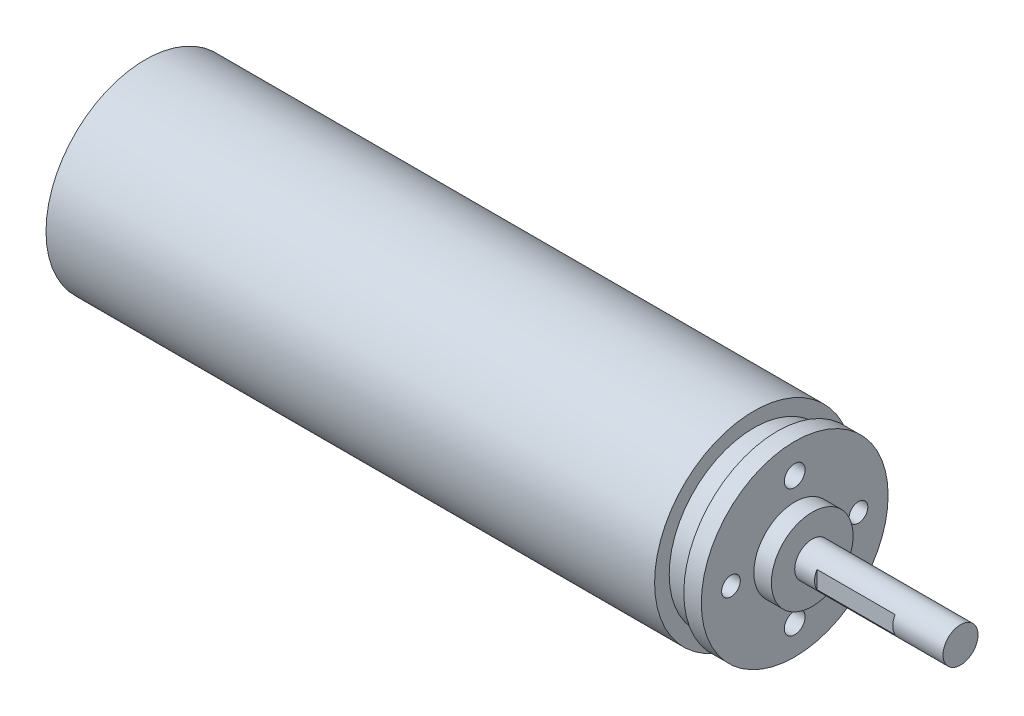
ISO-10303-21;
HEADER;
FILE_DESCRIPTION(('STEP AP214'),'2;1');
FILE_NAME('part.step','',(''),(''),'','','');
FILE_SCHEMA(('AUTOMOTIVE_DESIGN { 1 0 10303 214 1 1 1 1 }'));
ENDSEC;
DATA;
#1=APPLICATION_CONTEXT('core data for automotive mechanical design processes');
#2=APPLICATION_PROTOCOL_DEFINITION('international standard','automotive_design',2000,#1);
#3=PRODUCT_CONTEXT('',#1,'mechanical');
#4=PRODUCT('Part','Part','',(#3));
#5=PRODUCT_RELATED_PRODUCT_CATEGORY('part','',(#4));
#6=PRODUCT_DEFINITION_FORMATION('','',#4);
#7=PRODUCT_DEFINITION_CONTEXT('part definition',#1,'design');
#8=PRODUCT_DEFINITION('design','',#6,#7);
#9=PRODUCT_DEFINITION_SHAPE('','',#8);
#10=(LENGTH_UNIT() NAMED_UNIT(*) SI_UNIT(.MILLI.,.METRE.));
#11=(NAMED_UNIT(*) PLANE_ANGLE_UNIT() SI_UNIT($,.RADIAN.));
#12=(NAMED_UNIT(*) SI_UNIT($,.STERADIAN.) SOLID_ANGLE_UNIT());
#13=UNCERTAINTY_MEASURE_WITH_UNIT(LENGTH_MEASURE(1.E-05),#10,'distance_accuracy_value','');
#14=(GEOMETRIC_REPRESENTATION_CONTEXT(3) GLOBAL_UNCERTAINTY_ASSIGNED_CONTEXT((#13)) GLOBAL_UNIT_ASSIGNED_CONTEXT((#10,
#11,#12)) REPRESENTATION_CONTEXT('',''));
#15=CARTESIAN_POINT('',(0.,0.,0.));
#16=DIRECTION('',(0.,0.,1.));
#17=DIRECTION('',(1.,0.,0.));
#18=AXIS2_PLACEMENT_3D('',#15,#16,#17);
#19=CARTESIAN_POINT('',(0.,0.,0.));
#20=DIRECTION('',(-1.,0.,0.));
#21=DIRECTION('',(0.,0.,1.));
#22=AXIS2_PLACEMENT_3D('',#19,#20,#21);
#23=CYLINDRICAL_SURFACE('',#22,1.5);
#24=CARTESIAN_POINT('',(33.5,0.,0.));
#25=DIRECTION('',(-1.,0.,0.));
#26=DIRECTION('',(0.,0.,1.));
#27=AXIS2_PLACEMENT_3D('',#24,#25,#26);
#28=CIRCLE('',#27,1.5);
#29=CARTESIAN_POINT('',(33.5,0.,1.5));
#30=VERTEX_POINT('',#29);
#31=EDGE_CURVE('E134',#30,#30,#28,.T.);
#32=ORIENTED_EDGE('',*,*,#31,.F.);
#33=EDGE_LOOP('',(#32));
#34=FACE_BOUND('',#33,.T.);
#35=CARTESIAN_POINT('',(46.2,0.,0.));
#36=DIRECTION('',(-1.,0.,0.));
#37=DIRECTION('',(0.,0.,1.));
#38=AXIS2_PLACEMENT_3D('',#35,#36,#37);
#39=CIRCLE('',#38,1.5);
#40=CARTESIAN_POINT('',(46.2,0.,1.5));
#41=VERTEX_POINT('',#40);
#42=EDGE_CURVE('E137',#41,#41,#39,.T.);
#43=ORIENTED_EDGE('',*,*,#42,.T.);
#44=EDGE_LOOP('',(#43));
#45=FACE_BOUND('',#44,.T.);
#46=CARTESIAN_POINT('',(41.9,0.,0.));
#47=DIRECTION('',(-1.,0.,0.));
#48=DIRECTION('',(0.,0.,1.));
#49=AXIS2_PLACEMENT_3D('',#46,#47,#48);
#50=CIRCLE('',#49,1.5);
#51=CARTESIAN_POINT('',(41.9,0.748331477354788,1.3));
#52=VERTEX_POINT('',#51);
#53=CARTESIAN_POINT('',(41.9,-0.748331477354789,1.3));
#54=VERTEX_POINT('',#53);
#55=EDGE_CURVE('E11',#52,#54,#50,.F.);
#56=ORIENTED_EDGE('',*,*,#55,.T.);
#57=DIRECTION('',(-1.,0.,0.));
#58=VECTOR('',#57,1.);
#59=CARTESIAN_POINT('',(0.,-0.748331477354788,1.3));
#60=LINE('',#59,#58);
#61=CARTESIAN_POINT('',(35.2,-0.748331477354788,1.3));
#62=VERTEX_POINT('',#61);
#63=EDGE_CURVE('E143',#54,#62,#60,.T.);
#64=ORIENTED_EDGE('',*,*,#63,.T.);
#65=CARTESIAN_POINT('',(35.2,0.,0.));
#66=DIRECTION('',(1.,0.,0.));
#67=DIRECTION('',(0.,0.,-1.));
#68=AXIS2_PLACEMENT_3D('',#65,#66,#67);
#69=CIRCLE('',#68,1.5);
#70=CARTESIAN_POINT('',(35.2,0.748331477354788,1.3));
#71=VERTEX_POINT('',#70);
#72=EDGE_CURVE('E140',#62,#71,#69,.F.);
#73=ORIENTED_EDGE('',*,*,#72,.T.);
#74=DIRECTION('',(-1.,0.,0.));
#75=VECTOR('',#74,1.);
#76=CARTESIAN_POINT('',(0.,0.748331477354788,1.3));
#77=LINE('',#76,#75);
#78=EDGE_CURVE('E44',#71,#52,#77,.F.);
#79=ORIENTED_EDGE('',*,*,#78,.T.);
#80=EDGE_LOOP('',(#56,#64,#73,#79));
#81=FACE_BOUND('',#80,.T.);
#82=ADVANCED_FACE('F36',(#34,#45,#81),#23,.T.);
#83=CARTESIAN_POINT('',(46.2,-1.5,0.));
#84=DIRECTION('',(1.,0.,0.));
#85=DIRECTION('',(0.,0.,-1.));
#86=AXIS2_PLACEMENT_3D('',#83,#84,#85);
#87=PLANE('',#86);
#88=ORIENTED_EDGE('',*,*,#42,.F.);
#89=EDGE_LOOP('',(#88));
#90=FACE_BOUND('',#89,.T.);
#91=ADVANCED_FACE('F38',(#90),#87,.T.);
#92=CARTESIAN_POINT('',(33.5,-3.5,0.));
#93=DIRECTION('',(1.,0.,0.));
#94=DIRECTION('',(0.,0.,-1.));
#95=AXIS2_PLACEMENT_3D('',#92,#93,#94);
#96=PLANE('',#95);
#97=ORIENTED_EDGE('',*,*,#31,.T.);
#98=EDGE_LOOP('',(#97));
#99=FACE_BOUND('',#98,.T.);
#100=CARTESIAN_POINT('',(33.5,0.,0.));
#101=DIRECTION('',(-1.,0.,0.));
#102=DIRECTION('',(0.,0.,1.));
#103=AXIS2_PLACEMENT_3D('',#100,#101,#102);
#104=CIRCLE('',#103,3.5);
#105=CARTESIAN_POINT('',(33.5,0.,3.5));
#106=VERTEX_POINT('',#105);
#107=EDGE_CURVE('E131',#106,#106,#104,.T.);
#108=ORIENTED_EDGE('',*,*,#107,.F.);
#109=EDGE_LOOP('',(#108));
#110=FACE_BOUND('',#109,.T.);
#111=ADVANCED_FACE('F166',(#99,#110),#96,.T.);
#112=CARTESIAN_POINT('',(0.,0.,0.));
#113=DIRECTION('',(-1.,0.,0.));
#114=DIRECTION('',(0.,0.,1.));
#115=AXIS2_PLACEMENT_3D('',#112,#113,#114);
#116=CYLINDRICAL_SURFACE('',#115,3.5);
#117=ORIENTED_EDGE('',*,*,#107,.T.);
#118=EDGE_LOOP('',(#117));
#119=FACE_BOUND('',#118,.T.);
#120=CARTESIAN_POINT('',(32.,0.,0.));
#121=DIRECTION('',(-1.,0.,0.));
#122=DIRECTION('',(0.,0.,1.));
#123=AXIS2_PLACEMENT_3D('',#120,#121,#122);
#124=CIRCLE('',#123,3.5);
#125=CARTESIAN_POINT('',(32.,0.,3.5));
#126=VERTEX_POINT('',#125);
#127=EDGE_CURVE('E128',#126,#126,#124,.T.);
#128=ORIENTED_EDGE('',*,*,#127,.F.);
#129=EDGE_LOOP('',(#128));
#130=FACE_BOUND('',#129,.T.);
#131=ADVANCED_FACE('F173',(#119,#130),#116,.T.);
#132=CARTESIAN_POINT('',(32.,-8.,0.));
#133=DIRECTION('',(1.,0.,0.));
#134=DIRECTION('',(0.,0.,-1.));
#135=AXIS2_PLACEMENT_3D('',#132,#133,#134);
#136=PLANE('',#135);
#137=CARTESIAN_POINT('',(32.,0.,5.46));
#138=DIRECTION('',(1.,0.,0.));
#139=DIRECTION('',(0.,0.,-1.));
#140=AXIS2_PLACEMENT_3D('',#137,#138,#139);
#141=CIRCLE('',#140,0.799999999999999);
#142=CARTESIAN_POINT('',(32.,0.,4.66));
#143=VERTEX_POINT('',#142);
#144=EDGE_CURVE('E85',#143,#143,#141,.T.);
#145=ORIENTED_EDGE('',*,*,#144,.F.);
#146=EDGE_LOOP('',(#145));
#147=FACE_BOUND('',#146,.T.);
#148=CARTESIAN_POINT('',(32.,0.,-5.46));
#149=DIRECTION('',(1.,0.,0.));
#150=DIRECTION('',(0.,0.,-1.));
#151=AXIS2_PLACEMENT_3D('',#148,#149,#150);
#152=CIRCLE('',#151,0.799999999999999);
#153=CARTESIAN_POINT('',(32.,0.,-6.26));
#154=VERTEX_POINT('',#153);
#155=EDGE_CURVE('E84',#154,#154,#152,.T.);
#156=ORIENTED_EDGE('',*,*,#155,.F.);
#157=EDGE_LOOP('',(#156));
#158=FACE_BOUND('',#157,.T.);
#159=CARTESIAN_POINT('',(32.,5.46,0.));
#160=DIRECTION('',(1.,0.,0.));
#161=DIRECTION('',(0.,0.,-1.));
#162=AXIS2_PLACEMENT_3D('',#159,#160,#161);
#163=CIRCLE('',#162,0.888999999999999);
#164=CARTESIAN_POINT('',(32.,5.46,-0.888999999999999));
#165=VERTEX_POINT('',#164);
#166=EDGE_CURVE('E97',#165,#165,#163,.T.);
#167=ORIENTED_EDGE('',*,*,#166,.F.);
#168=EDGE_LOOP('',(#167));
#169=FACE_BOUND('',#168,.T.);
#170=CARTESIAN_POINT('',(32.,-5.46,0.));
#171=DIRECTION('',(1.,0.,0.));
#172=DIRECTION('',(0.,0.,-1.));
#173=AXIS2_PLACEMENT_3D('',#170,#171,#172);
#174=CIRCLE('',#173,0.888999999999999);
#175=CARTESIAN_POINT('',(32.,-5.46,-0.889));
#176=VERTEX_POINT('',#175);
#177=EDGE_CURVE('E103',#176,#176,#174,.T.);
#178=ORIENTED_EDGE('',*,*,#177,.F.);
#179=EDGE_LOOP('',(#178));
#180=FACE_BOUND('',#179,.T.);
#181=ORIENTED_EDGE('',*,*,#127,.T.);
#182=EDGE_LOOP('',(#181));
#183=FACE_BOUND('',#182,.T.);
#184=CARTESIAN_POINT('',(32.,0.,0.));
#185=DIRECTION('',(-1.,0.,0.));
#186=DIRECTION('',(0.,0.,1.));
#187=AXIS2_PLACEMENT_3D('',#184,#185,#186);
#188=CIRCLE('',#187,8.);
#189=CARTESIAN_POINT('',(32.,0.,8.));
#190=VERTEX_POINT('',#189);
#191=EDGE_CURVE('E125',#190,#190,#188,.T.);
#192=ORIENTED_EDGE('',*,*,#191,.F.);
#193=EDGE_LOOP('',(#192));
#194=FACE_BOUND('',#193,.T.);
#195=ADVANCED_FACE('F177',(#147,#158,#169,#180,#183,#194),#136,.T.);
#196=CARTESIAN_POINT('',(0.,0.,0.));
#197=DIRECTION('',(-1.,0.,0.));
#198=DIRECTION('',(0.,0.,1.));
#199=AXIS2_PLACEMENT_3D('',#196,#197,#198);
#200=CYLINDRICAL_SURFACE('',#199,8.);
#201=ORIENTED_EDGE('',*,*,#191,.T.);
#202=EDGE_LOOP('',(#201));
#203=FACE_BOUND('',#202,.T.);
#204=CARTESIAN_POINT('',(30.5,0.,0.));
#205=DIRECTION('',(-1.,0.,0.));
#206=DIRECTION('',(0.,0.,1.));
#207=AXIS2_PLACEMENT_3D('',#204,#205,#206);
#208=CIRCLE('',#207,8.);
#209=CARTESIAN_POINT('',(30.5,0.,8.));
#210=VERTEX_POINT('',#209);
#211=EDGE_CURVE('E122',#210,#210,#208,.T.);
#212=ORIENTED_EDGE('',*,*,#211,.F.);
#213=EDGE_LOOP('',(#212));
#214=FACE_BOUND('',#213,.T.);
#215=ADVANCED_FACE('F181',(#203,#214),#200,.T.);
#216=CARTESIAN_POINT('',(30.5,-7.25,0.));
#217=DIRECTION('',(-1.,0.,0.));
#218=DIRECTION('',(0.,0.,1.));
#219=AXIS2_PLACEMENT_3D('',#216,#217,#218);
#220=PLANE('',#219);
#221=ORIENTED_EDGE('',*,*,#211,.T.);
#222=EDGE_LOOP('',(#221));
#223=FACE_BOUND('',#222,.T.);
#224=CARTESIAN_POINT('',(30.5,0.,0.));
#225=DIRECTION('',(-1.,0.,0.));
#226=DIRECTION('',(0.,0.,1.));
#227=AXIS2_PLACEMENT_3D('',#224,#225,#226);
#228=CIRCLE('',#227,7.25);
#229=CARTESIAN_POINT('',(30.5,0.,7.25));
#230=VERTEX_POINT('',#229);
#231=EDGE_CURVE('E119',#230,#230,#228,.T.);
#232=ORIENTED_EDGE('',*,*,#231,.F.);
#233=EDGE_LOOP('',(#232));
#234=FACE_BOUND('',#233,.T.);
#235=ADVANCED_FACE('F185',(#223,#234),#220,.T.);
#236=CARTESIAN_POINT('',(0.,0.,0.));
#237=DIRECTION('',(-1.,0.,0.));
#238=DIRECTION('',(0.,0.,1.));
#239=AXIS2_PLACEMENT_3D('',#236,#237,#238);
#240=CYLINDRICAL_SURFACE('',#239,7.25);
#241=ORIENTED_EDGE('',*,*,#231,.T.);
#242=EDGE_LOOP('',(#241));
#243=FACE_BOUND('',#242,.T.);
#244=CARTESIAN_POINT('',(28.5,0.,0.));
#245=DIRECTION('',(-1.,0.,0.));
#246=DIRECTION('',(0.,0.,1.));
#247=AXIS2_PLACEMENT_3D('',#244,#245,#246);
#248=CIRCLE('',#247,7.25);
#249=CARTESIAN_POINT('',(28.5,0.,7.25));
#250=VERTEX_POINT('',#249);
#251=EDGE_CURVE('E116',#250,#250,#248,.T.);
#252=ORIENTED_EDGE('',*,*,#251,.F.);
#253=EDGE_LOOP('',(#252));
#254=FACE_BOUND('',#253,.T.);
#255=ADVANCED_FACE('F189',(#243,#254),#240,.T.);
#256=CARTESIAN_POINT('',(28.5,-8.5,0.));
#257=DIRECTION('',(1.,0.,0.));
#258=DIRECTION('',(0.,0.,-1.));
#259=AXIS2_PLACEMENT_3D('',#256,#257,#258);
#260=PLANE('',#259);
#261=ORIENTED_EDGE('',*,*,#251,.T.);
#262=EDGE_LOOP('',(#261));
#263=FACE_BOUND('',#262,.T.);
#264=CARTESIAN_POINT('',(28.5,0.,0.));
#265=DIRECTION('',(-1.,0.,0.));
#266=DIRECTION('',(0.,0.,1.));
#267=AXIS2_PLACEMENT_3D('',#264,#265,#266);
#268=CIRCLE('',#267,8.5);
#269=CARTESIAN_POINT('',(28.5,0.,8.5));
#270=VERTEX_POINT('',#269);
#271=EDGE_CURVE('E113',#270,#270,#268,.T.);
#272=ORIENTED_EDGE('',*,*,#271,.F.);
#273=EDGE_LOOP('',(#272));
#274=FACE_BOUND('',#273,.T.);
#275=ADVANCED_FACE('F158',(#263,#274),#260,.T.);
#276=CARTESIAN_POINT('',(0.,0.,0.));
#277=DIRECTION('',(-1.,0.,0.));
#278=DIRECTION('',(0.,0.,1.));
#279=AXIS2_PLACEMENT_3D('',#276,#277,#278);
#280=CYLINDRICAL_SURFACE('',#279,8.5);
#281=ORIENTED_EDGE('',*,*,#271,.T.);
#282=EDGE_LOOP('',(#281));
#283=FACE_BOUND('',#282,.T.);
#284=CARTESIAN_POINT('',(-23.622,0.,0.));
#285=DIRECTION('',(-1.,0.,0.));
#286=DIRECTION('',(0.,0.,1.));
#287=AXIS2_PLACEMENT_3D('',#284,#285,#286);
#288=CIRCLE('',#287,8.5);
#289=CARTESIAN_POINT('',(-23.622,0.,8.5));
#290=VERTEX_POINT('',#289);
#291=EDGE_CURVE('E91',#290,#290,#288,.T.);
#292=ORIENTED_EDGE('',*,*,#291,.F.);
#293=EDGE_LOOP('',(#292));
#294=FACE_BOUND('',#293,.T.);
#295=ADVANCED_FACE('F150',(#283,#294),#280,.T.);
#296=CARTESIAN_POINT('',(41.9,2.54,1.3));
#297=DIRECTION('',(-1.,0.,0.));
#298=DIRECTION('',(0.,0.,1.));
#299=AXIS2_PLACEMENT_3D('',#296,#297,#298);
#300=PLANE('',#299);
#301=ORIENTED_EDGE('',*,*,#55,.F.);
#302=DIRECTION('',(0.,-1.,0.));
#303=VECTOR('',#302,1.);
#304=CARTESIAN_POINT('',(41.9,2.54,1.3));
#305=LINE('',#304,#303);
#306=EDGE_CURVE('E110',#52,#54,#305,.T.);
#307=ORIENTED_EDGE('',*,*,#306,.T.);
#308=EDGE_LOOP('',(#301,#307));
#309=FACE_BOUND('',#308,.T.);
#310=ADVANCED_FACE('F148',(#309),#300,.T.);
#311=CARTESIAN_POINT('',(35.2,2.54,1.3));
#312=DIRECTION('',(0.,0.,1.));
#313=DIRECTION('',(1.,0.,0.));
#314=AXIS2_PLACEMENT_3D('',#311,#312,#313);
#315=PLANE('',#314);
#316=DIRECTION('',(0.,-1.,0.));
#317=VECTOR('',#316,1.);
#318=CARTESIAN_POINT('',(35.2,2.54,1.3));
#319=LINE('',#318,#317);
#320=EDGE_CURVE('E50',#71,#62,#319,.T.);
#321=ORIENTED_EDGE('',*,*,#320,.T.);
#322=ORIENTED_EDGE('',*,*,#63,.F.);
#323=ORIENTED_EDGE('',*,*,#306,.F.);
#324=ORIENTED_EDGE('',*,*,#78,.F.);
#325=EDGE_LOOP('',(#321,#322,#323,#324));
#326=FACE_BOUND('',#325,.T.);
#327=ADVANCED_FACE('F146',(#326),#315,.T.);
#328=CARTESIAN_POINT('',(35.2,2.54,1.5));
#329=DIRECTION('',(1.,0.,0.));
#330=DIRECTION('',(0.,0.,-1.));
#331=AXIS2_PLACEMENT_3D('',#328,#329,#330);
#332=PLANE('',#331);
#333=ORIENTED_EDGE('',*,*,#320,.F.);
#334=ORIENTED_EDGE('',*,*,#72,.F.);
#335=EDGE_LOOP('',(#333,#334));
#336=FACE_BOUND('',#335,.T.);
#337=ADVANCED_FACE('F156',(#336),#332,.T.);
#338=CARTESIAN_POINT('',(25.396,-5.46,0.));
#339=DIRECTION('',(1.,0.,0.));
#340=DIRECTION('',(0.,0.,-1.));
#341=AXIS2_PLACEMENT_3D('',#338,#339,#340);
#342=CONICAL_SURFACE('',#341,0.888999999999998,1.02974425867665);
#343=CARTESIAN_POINT('',(24.8618349096845,-5.46,0.));
#344=VERTEX_POINT('',#343);
#345=VERTEX_LOOP('',#344);
#346=FACE_BOUND('',#345,.T.);
#347=CARTESIAN_POINT('',(25.396,-5.46,0.));
#348=DIRECTION('',(1.,0.,0.));
#349=DIRECTION('',(0.,0.,-1.));
#350=AXIS2_PLACEMENT_3D('',#347,#348,#349);
#351=CIRCLE('',#350,0.888999999999998);
#352=CARTESIAN_POINT('',(25.396,-5.46,-0.888999999999999));
#353=VERTEX_POINT('',#352);
#354=EDGE_CURVE('E106',#353,#353,#351,.T.);
#355=ORIENTED_EDGE('',*,*,#354,.T.);
#356=EDGE_LOOP('',(#355));
#357=FACE_BOUND('',#356,.T.);
#358=ADVANCED_FACE('F231',(#346,#357),#342,.F.);
#359=CARTESIAN_POINT('',(32.,-5.46,0.));
#360=DIRECTION('',(1.,0.,0.));
#361=DIRECTION('',(0.,0.,-1.));
#362=AXIS2_PLACEMENT_3D('',#359,#360,#361);
#363=CYLINDRICAL_SURFACE('',#362,0.888999999999999);
#364=ORIENTED_EDGE('',*,*,#354,.F.);
#365=EDGE_LOOP('',(#364));
#366=FACE_BOUND('',#365,.T.);
#367=ORIENTED_EDGE('',*,*,#177,.T.);
#368=EDGE_LOOP('',(#367));
#369=FACE_BOUND('',#368,.T.);
#370=ADVANCED_FACE('F227',(#366,#369),#363,.F.);
#371=CARTESIAN_POINT('',(25.396,5.46,0.));
#372=DIRECTION('',(1.,0.,0.));
#373=DIRECTION('',(0.,0.,-1.));
#374=AXIS2_PLACEMENT_3D('',#371,#372,#373);
#375=CONICAL_SURFACE('',#374,0.888999999999998,1.02974425867665);
#376=CARTESIAN_POINT('',(24.8618349096845,5.46,0.));
#377=VERTEX_POINT('',#376);
#378=VERTEX_LOOP('',#377);
#379=FACE_BOUND('',#378,.T.);
#380=CARTESIAN_POINT('',(25.396,5.46,0.));
#381=DIRECTION('',(1.,0.,0.));
#382=DIRECTION('',(0.,0.,-1.));
#383=AXIS2_PLACEMENT_3D('',#380,#381,#382);
#384=CIRCLE('',#383,0.888999999999998);
#385=CARTESIAN_POINT('',(25.396,5.46,-0.888999999999998));
#386=VERTEX_POINT('',#385);
#387=EDGE_CURVE('E100',#386,#386,#384,.T.);
#388=ORIENTED_EDGE('',*,*,#387,.T.);
#389=EDGE_LOOP('',(#388));
#390=FACE_BOUND('',#389,.T.);
#391=ADVANCED_FACE('F223',(#379,#390),#375,.F.);
#392=CARTESIAN_POINT('',(32.,5.46,0.));
#393=DIRECTION('',(1.,0.,0.));
#394=DIRECTION('',(0.,0.,-1.));
#395=AXIS2_PLACEMENT_3D('',#392,#393,#394);
#396=CYLINDRICAL_SURFACE('',#395,0.888999999999999);
#397=ORIENTED_EDGE('',*,*,#387,.F.);
#398=EDGE_LOOP('',(#397));
#399=FACE_BOUND('',#398,.T.);
#400=ORIENTED_EDGE('',*,*,#166,.T.);
#401=EDGE_LOOP('',(#400));
#402=FACE_BOUND('',#401,.T.);
#403=ADVANCED_FACE('F219',(#399,#402),#396,.F.);
#404=CARTESIAN_POINT('',(25.904,0.,-5.46));
#405=DIRECTION('',(1.,0.,0.));
#406=DIRECTION('',(0.,0.,-1.));
#407=AXIS2_PLACEMENT_3D('',#404,#405,#406);
#408=CONICAL_SURFACE('',#407,0.799999999999999,1.02974425867665);
#409=CARTESIAN_POINT('',(25.423311504778,0.,-5.46));
#410=VERTEX_POINT('',#409);
#411=VERTEX_LOOP('',#410);
#412=FACE_BOUND('',#411,.T.);
#413=CARTESIAN_POINT('',(25.904,0.,-5.46));
#414=DIRECTION('',(1.,0.,0.));
#415=DIRECTION('',(0.,0.,-1.));
#416=AXIS2_PLACEMENT_3D('',#413,#414,#415);
#417=CIRCLE('',#416,0.799999999999999);
#418=CARTESIAN_POINT('',(25.904,0.,-6.26));
#419=VERTEX_POINT('',#418);
#420=EDGE_CURVE('E88',#419,#419,#417,.T.);
#421=ORIENTED_EDGE('',*,*,#420,.T.);
#422=EDGE_LOOP('',(#421));
#423=FACE_BOUND('',#422,.T.);
#424=ADVANCED_FACE('F215',(#412,#423),#408,.F.);
#425=CARTESIAN_POINT('',(32.,0.,-5.46));
#426=DIRECTION('',(1.,0.,0.));
#427=DIRECTION('',(0.,0.,-1.));
#428=AXIS2_PLACEMENT_3D('',#425,#426,#427);
#429=CYLINDRICAL_SURFACE('',#428,0.799999999999999);
#430=ORIENTED_EDGE('',*,*,#420,.F.);
#431=EDGE_LOOP('',(#430));
#432=FACE_BOUND('',#431,.T.);
#433=ORIENTED_EDGE('',*,*,#155,.T.);
#434=EDGE_LOOP('',(#433));
#435=FACE_BOUND('',#434,.T.);
#436=ADVANCED_FACE('F78',(#432,#435),#429,.F.);
#437=CARTESIAN_POINT('',(25.904,0.,5.46));
#438=DIRECTION('',(1.,0.,0.));
#439=DIRECTION('',(0.,0.,-1.));
#440=AXIS2_PLACEMENT_3D('',#437,#438,#439);
#441=CONICAL_SURFACE('',#440,0.799999999999999,1.02974425867665);
#442=CARTESIAN_POINT('',(25.423311504778,0.,5.46));
#443=VERTEX_POINT('',#442);
#444=VERTEX_LOOP('',#443);
#445=FACE_BOUND('',#444,.T.);
#446=CARTESIAN_POINT('',(25.904,0.,5.46));
#447=DIRECTION('',(1.,0.,0.));
#448=DIRECTION('',(0.,0.,-1.));
#449=AXIS2_PLACEMENT_3D('',#446,#447,#448);
#450=CIRCLE('',#449,0.799999999999999);
#451=CARTESIAN_POINT('',(25.904,0.,4.66));
#452=VERTEX_POINT('',#451);
#453=EDGE_CURVE('E82',#452,#452,#450,.T.);
#454=ORIENTED_EDGE('',*,*,#453,.T.);
#455=EDGE_LOOP('',(#454));
#456=FACE_BOUND('',#455,.T.);
#457=ADVANCED_FACE('F74',(#445,#456),#441,.F.);
#458=CARTESIAN_POINT('',(32.,0.,5.46));
#459=DIRECTION('',(1.,0.,0.));
#460=DIRECTION('',(0.,0.,-1.));
#461=AXIS2_PLACEMENT_3D('',#458,#459,#460);
#462=CYLINDRICAL_SURFACE('',#461,0.799999999999999);
#463=ORIENTED_EDGE('',*,*,#453,.F.);
#464=EDGE_LOOP('',(#463));
#465=FACE_BOUND('',#464,.T.);
#466=ORIENTED_EDGE('',*,*,#144,.T.);
#467=EDGE_LOOP('',(#466));
#468=FACE_BOUND('',#467,.T.);
#469=ADVANCED_FACE('F77',(#465,#468),#462,.F.);
#470=CARTESIAN_POINT('',(-23.622,0.,0.));
#471=DIRECTION('',(-1.,0.,0.));
#472=DIRECTION('',(0.,0.,1.));
#473=AXIS2_PLACEMENT_3D('',#470,#471,#472);
#474=PLANE('',#473);
#475=ORIENTED_EDGE('',*,*,#291,.T.);
#476=EDGE_LOOP('',(#475));
#477=FACE_BOUND('',#476,.T.);
#478=ADVANCED_FACE('F205',(#477),#474,.T.);
#479=CLOSED_SHELL('',(#82,#91,#111,#131,#195,#215,#235,#255,#275,#295,#310,#327,#337,#358,#370,
#391,#403,#424,#436,#457,#469,#478));
#480=MANIFOLD_SOLID_BREP('B2',#479);
#481=ADVANCED_BREP_SHAPE_REPRESENTATION('',(#18,#480),#14);
#482=SHAPE_DEFINITION_REPRESENTATION(#9,#481);
ENDSEC;
END-ISO-10303-21;
